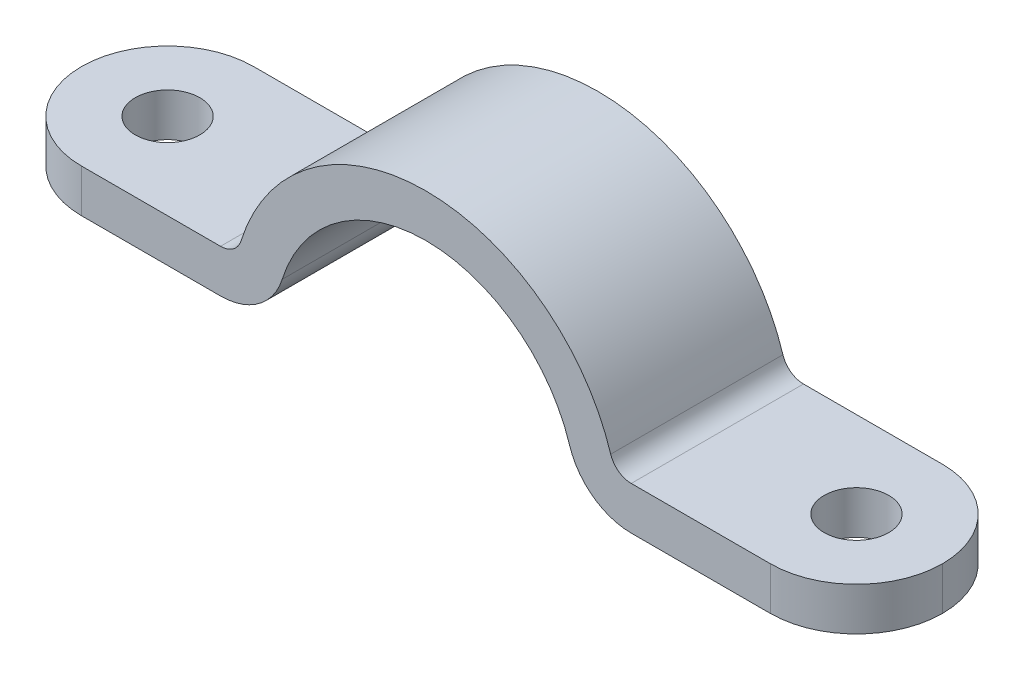
ISO-10303-21;
HEADER;
FILE_DESCRIPTION(('STEP AP214'),'2;1');
FILE_NAME('part.step','',(''),(''),'','','');
FILE_SCHEMA(('AUTOMOTIVE_DESIGN { 1 0 10303 214 1 1 1 1 }'));
ENDSEC;
DATA;
#1=APPLICATION_CONTEXT('core data for automotive mechanical design processes');
#2=APPLICATION_PROTOCOL_DEFINITION('international standard','automotive_design',2000,#1);
#3=PRODUCT_CONTEXT('',#1,'mechanical');
#4=PRODUCT('Part','Part','',(#3));
#5=PRODUCT_RELATED_PRODUCT_CATEGORY('part','',(#4));
#6=PRODUCT_DEFINITION_FORMATION('','',#4);
#7=PRODUCT_DEFINITION_CONTEXT('part definition',#1,'design');
#8=PRODUCT_DEFINITION('design','',#6,#7);
#9=PRODUCT_DEFINITION_SHAPE('','',#8);
#10=(LENGTH_UNIT() NAMED_UNIT(*) SI_UNIT(.MILLI.,.METRE.));
#11=(NAMED_UNIT(*) PLANE_ANGLE_UNIT() SI_UNIT($,.RADIAN.));
#12=(NAMED_UNIT(*) SI_UNIT($,.STERADIAN.) SOLID_ANGLE_UNIT());
#13=UNCERTAINTY_MEASURE_WITH_UNIT(LENGTH_MEASURE(1.E-05),#10,'distance_accuracy_value','');
#14=(GEOMETRIC_REPRESENTATION_CONTEXT(3) GLOBAL_UNCERTAINTY_ASSIGNED_CONTEXT((#13)) GLOBAL_UNIT_ASSIGNED_CONTEXT((#10,
#11,#12)) REPRESENTATION_CONTEXT('',''));
#15=CARTESIAN_POINT('',(0.,0.,0.));
#16=DIRECTION('',(0.,0.,1.));
#17=DIRECTION('',(1.,0.,0.));
#18=AXIS2_PLACEMENT_3D('',#15,#16,#17);
#19=CARTESIAN_POINT('',(-100.,0.,40.));
#20=DIRECTION('',(0.,1.,0.));
#21=DIRECTION('',(-1.,0.,0.));
#22=AXIS2_PLACEMENT_3D('',#19,#20,#21);
#23=PLANE('',#22);
#24=CARTESIAN_POINT('',(-80.,0.,20.));
#25=DIRECTION('',(0.,1.,0.));
#26=DIRECTION('',(0.,0.,1.));
#27=AXIS2_PLACEMENT_3D('',#24,#25,#26);
#28=CIRCLE('',#27,7.5);
#29=CARTESIAN_POINT('',(-80.,0.,27.5));
#30=VERTEX_POINT('',#29);
#31=EDGE_CURVE('E239',#30,#30,#28,.T.);
#32=ORIENTED_EDGE('',*,*,#31,.T.);
#33=EDGE_LOOP('',(#32));
#34=FACE_BOUND('',#33,.T.);
#35=CARTESIAN_POINT('',(-80.,0.,20.));
#36=DIRECTION('',(0.,1.,0.));
#37=DIRECTION('',(-1.,0.,0.));
#38=AXIS2_PLACEMENT_3D('',#35,#36,#37);
#39=CIRCLE('',#38,20.);
#40=CARTESIAN_POINT('',(-80.,0.,40.));
#41=VERTEX_POINT('',#40);
#42=CARTESIAN_POINT('',(-100.,0.,20.));
#43=VERTEX_POINT('',#42);
#44=EDGE_CURVE('E56',#41,#43,#39,.F.);
#45=ORIENTED_EDGE('',*,*,#44,.T.);
#46=CARTESIAN_POINT('',(-80.,0.,20.));
#47=DIRECTION('',(0.,1.,0.));
#48=DIRECTION('',(-1.,0.,0.));
#49=AXIS2_PLACEMENT_3D('',#46,#47,#48);
#50=CIRCLE('',#49,20.);
#51=CARTESIAN_POINT('',(-80.,0.,0.));
#52=VERTEX_POINT('',#51);
#53=EDGE_CURVE('E232',#43,#52,#50,.F.);
#54=ORIENTED_EDGE('',*,*,#53,.T.);
#55=DIRECTION('',(1.,0.,0.));
#56=VECTOR('',#55,1.);
#57=CARTESIAN_POINT('',(-100.,0.,0.));
#58=LINE('',#57,#56);
#59=CARTESIAN_POINT('',(-47.6969600708473,0.,0.));
#60=VERTEX_POINT('',#59);
#61=EDGE_CURVE('E148',#52,#60,#58,.T.);
#62=ORIENTED_EDGE('',*,*,#61,.T.);
#63=DIRECTION('',(0.,0.,-1.));
#64=VECTOR('',#63,1.);
#65=CARTESIAN_POINT('',(-47.6969600708473,0.,40.));
#66=LINE('',#65,#64);
#67=CARTESIAN_POINT('',(-47.6969600708473,0.,40.));
#68=VERTEX_POINT('',#67);
#69=EDGE_CURVE('E146',#68,#60,#66,.T.);
#70=ORIENTED_EDGE('',*,*,#69,.F.);
#71=DIRECTION('',(1.,0.,0.));
#72=VECTOR('',#71,1.);
#73=CARTESIAN_POINT('',(-100.,0.,40.));
#74=LINE('',#73,#72);
#75=EDGE_CURVE('E133',#41,#68,#74,.T.);
#76=ORIENTED_EDGE('',*,*,#75,.F.);
#77=EDGE_LOOP('',(#45,#54,#62,#70,#76));
#78=FACE_BOUND('',#77,.T.);
#79=ADVANCED_FACE('F33',(#34,#78),#23,.F.);
#80=CARTESIAN_POINT('',(-47.6969600708473,15.,40.));
#81=DIRECTION('',(0.,0.,-1.));
#82=DIRECTION('',(-1.,0.,0.));
#83=AXIS2_PLACEMENT_3D('',#80,#81,#82);
#84=CYLINDRICAL_SURFACE('',#83,15.);
#85=CARTESIAN_POINT('',(-47.6969600708473,15.,0.));
#86=DIRECTION('',(0.,0.,1.));
#87=DIRECTION('',(-1.,0.,0.));
#88=AXIS2_PLACEMENT_3D('',#85,#86,#87);
#89=CIRCLE('',#88,15.);
#90=CARTESIAN_POINT('',(-33.3878720495931,10.5,0.));
#91=VERTEX_POINT('',#90);
#92=EDGE_CURVE('E178',#60,#91,#89,.T.);
#93=ORIENTED_EDGE('',*,*,#92,.T.);
#94=DIRECTION('',(0.,0.,-1.));
#95=VECTOR('',#94,1.);
#96=CARTESIAN_POINT('',(-33.3878720495931,10.5,40.));
#97=LINE('',#96,#95);
#98=CARTESIAN_POINT('',(-33.3878720495931,10.5,40.));
#99=VERTEX_POINT('',#98);
#100=EDGE_CURVE('E152',#99,#91,#97,.T.);
#101=ORIENTED_EDGE('',*,*,#100,.F.);
#102=CARTESIAN_POINT('',(-47.6969600708473,15.,40.));
#103=DIRECTION('',(0.,0.,1.));
#104=DIRECTION('',(-1.,0.,0.));
#105=AXIS2_PLACEMENT_3D('',#102,#103,#104);
#106=CIRCLE('',#105,15.);
#107=EDGE_CURVE('E138',#68,#99,#106,.T.);
#108=ORIENTED_EDGE('',*,*,#107,.F.);
#109=ORIENTED_EDGE('',*,*,#69,.T.);
#110=EDGE_LOOP('',(#93,#101,#108,#109));
#111=FACE_BOUND('',#110,.T.);
#112=ADVANCED_FACE('F154',(#111),#84,.T.);
#113=CARTESIAN_POINT('',(0.,0.,40.));
#114=DIRECTION('',(0.,0.,-1.));
#115=DIRECTION('',(-1.,0.,0.));
#116=AXIS2_PLACEMENT_3D('',#113,#114,#115);
#117=CYLINDRICAL_SURFACE('',#116,35.);
#118=CARTESIAN_POINT('',(0.,0.,0.));
#119=DIRECTION('',(0.,0.,-1.));
#120=DIRECTION('',(1.,0.,0.));
#121=AXIS2_PLACEMENT_3D('',#118,#119,#120);
#122=CIRCLE('',#121,35.);
#123=CARTESIAN_POINT('',(33.3878720495931,10.5,0.));
#124=VERTEX_POINT('',#123);
#125=EDGE_CURVE('E181',#91,#124,#122,.T.);
#126=ORIENTED_EDGE('',*,*,#125,.T.);
#127=DIRECTION('',(0.,0.,-1.));
#128=VECTOR('',#127,1.);
#129=CARTESIAN_POINT('',(33.3878720495931,10.5,40.));
#130=LINE('',#129,#128);
#131=CARTESIAN_POINT('',(33.3878720495931,10.5,40.));
#132=VERTEX_POINT('',#131);
#133=EDGE_CURVE('E211',#132,#124,#130,.T.);
#134=ORIENTED_EDGE('',*,*,#133,.F.);
#135=CARTESIAN_POINT('',(0.,0.,40.));
#136=DIRECTION('',(0.,0.,-1.));
#137=DIRECTION('',(1.,0.,0.));
#138=AXIS2_PLACEMENT_3D('',#135,#136,#137);
#139=CIRCLE('',#138,35.);
#140=EDGE_CURVE('E157',#99,#132,#139,.T.);
#141=ORIENTED_EDGE('',*,*,#140,.F.);
#142=ORIENTED_EDGE('',*,*,#100,.T.);
#143=EDGE_LOOP('',(#126,#134,#141,#142));
#144=FACE_BOUND('',#143,.T.);
#145=ADVANCED_FACE('F288',(#144),#117,.F.);
#146=CARTESIAN_POINT('',(47.6969600708473,15.,40.));
#147=DIRECTION('',(0.,0.,-1.));
#148=DIRECTION('',(-1.,0.,0.));
#149=AXIS2_PLACEMENT_3D('',#146,#147,#148);
#150=CYLINDRICAL_SURFACE('',#149,15.);
#151=CARTESIAN_POINT('',(47.6969600708473,15.,0.));
#152=DIRECTION('',(0.,0.,1.));
#153=DIRECTION('',(-1.,0.,0.));
#154=AXIS2_PLACEMENT_3D('',#151,#152,#153);
#155=CIRCLE('',#154,15.);
#156=CARTESIAN_POINT('',(47.6969600708473,0.,0.));
#157=VERTEX_POINT('',#156);
#158=EDGE_CURVE('E183',#124,#157,#155,.T.);
#159=ORIENTED_EDGE('',*,*,#158,.T.);
#160=DIRECTION('',(0.,0.,-1.));
#161=VECTOR('',#160,1.);
#162=CARTESIAN_POINT('',(47.6969600708473,0.,40.));
#163=LINE('',#162,#161);
#164=CARTESIAN_POINT('',(47.6969600708473,0.,40.));
#165=VERTEX_POINT('',#164);
#166=EDGE_CURVE('E208',#165,#157,#163,.T.);
#167=ORIENTED_EDGE('',*,*,#166,.F.);
#168=CARTESIAN_POINT('',(47.6969600708473,15.,40.));
#169=DIRECTION('',(0.,0.,1.));
#170=DIRECTION('',(-1.,0.,0.));
#171=AXIS2_PLACEMENT_3D('',#168,#169,#170);
#172=CIRCLE('',#171,15.);
#173=EDGE_CURVE('E159',#132,#165,#172,.T.);
#174=ORIENTED_EDGE('',*,*,#173,.F.);
#175=ORIENTED_EDGE('',*,*,#133,.T.);
#176=EDGE_LOOP('',(#159,#167,#174,#175));
#177=FACE_BOUND('',#176,.T.);
#178=ADVANCED_FACE('F284',(#177),#150,.T.);
#179=CARTESIAN_POINT('',(47.6969600708473,0.,40.));
#180=DIRECTION('',(0.,1.,0.));
#181=DIRECTION('',(-1.,0.,0.));
#182=AXIS2_PLACEMENT_3D('',#179,#180,#181);
#183=PLANE('',#182);
#184=CARTESIAN_POINT('',(80.,0.,20.));
#185=DIRECTION('',(0.,1.,0.));
#186=DIRECTION('',(0.,0.,1.));
#187=AXIS2_PLACEMENT_3D('',#184,#185,#186);
#188=CIRCLE('',#187,7.5);
#189=CARTESIAN_POINT('',(80.,0.,27.5));
#190=VERTEX_POINT('',#189);
#191=EDGE_CURVE('E248',#190,#190,#188,.T.);
#192=ORIENTED_EDGE('',*,*,#191,.T.);
#193=EDGE_LOOP('',(#192));
#194=FACE_BOUND('',#193,.T.);
#195=DIRECTION('',(1.,0.,0.));
#196=VECTOR('',#195,1.);
#197=CARTESIAN_POINT('',(47.6969600708473,0.,0.));
#198=LINE('',#197,#196);
#199=CARTESIAN_POINT('',(80.,0.,0.));
#200=VERTEX_POINT('',#199);
#201=EDGE_CURVE('E185',#157,#200,#198,.T.);
#202=ORIENTED_EDGE('',*,*,#201,.T.);
#203=CARTESIAN_POINT('',(80.,0.,20.));
#204=DIRECTION('',(0.,1.,0.));
#205=DIRECTION('',(-1.,0.,0.));
#206=AXIS2_PLACEMENT_3D('',#203,#204,#205);
#207=CIRCLE('',#206,20.);
#208=CARTESIAN_POINT('',(100.,0.,20.));
#209=VERTEX_POINT('',#208);
#210=EDGE_CURVE('E226',#200,#209,#207,.F.);
#211=ORIENTED_EDGE('',*,*,#210,.T.);
#212=CARTESIAN_POINT('',(80.,0.,20.));
#213=DIRECTION('',(0.,1.,0.));
#214=DIRECTION('',(-1.,0.,0.));
#215=AXIS2_PLACEMENT_3D('',#212,#213,#214);
#216=CIRCLE('',#215,20.);
#217=CARTESIAN_POINT('',(80.,0.,40.));
#218=VERTEX_POINT('',#217);
#219=EDGE_CURVE('E224',#209,#218,#216,.F.);
#220=ORIENTED_EDGE('',*,*,#219,.T.);
#221=DIRECTION('',(1.,0.,0.));
#222=VECTOR('',#221,1.);
#223=CARTESIAN_POINT('',(47.6969600708473,0.,40.));
#224=LINE('',#223,#222);
#225=EDGE_CURVE('E164',#165,#218,#224,.T.);
#226=ORIENTED_EDGE('',*,*,#225,.F.);
#227=ORIENTED_EDGE('',*,*,#166,.T.);
#228=EDGE_LOOP('',(#202,#211,#220,#226,#227));
#229=FACE_BOUND('',#228,.T.);
#230=ADVANCED_FACE('F262',(#194,#229),#183,.F.);
#231=CARTESIAN_POINT('',(47.6969600708473,10.,40.));
#232=DIRECTION('',(0.,-1.,0.));
#233=DIRECTION('',(1.,0.,0.));
#234=AXIS2_PLACEMENT_3D('',#231,#232,#233);
#235=PLANE('',#234);
#236=CARTESIAN_POINT('',(80.,10.,20.));
#237=DIRECTION('',(0.,1.,0.));
#238=DIRECTION('',(0.,0.,1.));
#239=AXIS2_PLACEMENT_3D('',#236,#237,#238);
#240=CIRCLE('',#239,7.5);
#241=CARTESIAN_POINT('',(80.,10.,27.5));
#242=VERTEX_POINT('',#241);
#243=EDGE_CURVE('E252',#242,#242,#240,.T.);
#244=ORIENTED_EDGE('',*,*,#243,.F.);
#245=EDGE_LOOP('',(#244));
#246=FACE_BOUND('',#245,.T.);
#247=CARTESIAN_POINT('',(80.,10.,20.));
#248=DIRECTION('',(0.,-1.,0.));
#249=DIRECTION('',(1.,0.,0.));
#250=AXIS2_PLACEMENT_3D('',#247,#248,#249);
#251=CIRCLE('',#250,20.);
#252=CARTESIAN_POINT('',(80.,10.,40.));
#253=VERTEX_POINT('',#252);
#254=CARTESIAN_POINT('',(100.,10.,20.));
#255=VERTEX_POINT('',#254);
#256=EDGE_CURVE('E151',#253,#255,#251,.F.);
#257=ORIENTED_EDGE('',*,*,#256,.T.);
#258=CARTESIAN_POINT('',(80.,10.,20.));
#259=DIRECTION('',(0.,-1.,0.));
#260=DIRECTION('',(1.,0.,0.));
#261=AXIS2_PLACEMENT_3D('',#258,#259,#260);
#262=CIRCLE('',#261,20.);
#263=CARTESIAN_POINT('',(80.,10.,0.));
#264=VERTEX_POINT('',#263);
#265=EDGE_CURVE('E216',#255,#264,#262,.F.);
#266=ORIENTED_EDGE('',*,*,#265,.T.);
#267=DIRECTION('',(-1.,0.,0.));
#268=VECTOR('',#267,1.);
#269=CARTESIAN_POINT('',(47.6969600708473,10.,0.));
#270=LINE('',#269,#268);
#271=CARTESIAN_POINT('',(47.6969600708473,10.,0.));
#272=VERTEX_POINT('',#271);
#273=EDGE_CURVE('E188',#264,#272,#270,.T.);
#274=ORIENTED_EDGE('',*,*,#273,.T.);
#275=DIRECTION('',(0.,0.,-1.));
#276=VECTOR('',#275,1.);
#277=CARTESIAN_POINT('',(47.6969600708473,10.,40.));
#278=LINE('',#277,#276);
#279=CARTESIAN_POINT('',(47.6969600708473,10.,40.));
#280=VERTEX_POINT('',#279);
#281=EDGE_CURVE('E205',#280,#272,#278,.T.);
#282=ORIENTED_EDGE('',*,*,#281,.F.);
#283=DIRECTION('',(-1.,0.,0.));
#284=VECTOR('',#283,1.);
#285=CARTESIAN_POINT('',(47.6969600708473,10.,40.));
#286=LINE('',#285,#284);
#287=EDGE_CURVE('E166',#253,#280,#286,.T.);
#288=ORIENTED_EDGE('',*,*,#287,.F.);
#289=EDGE_LOOP('',(#257,#266,#274,#282,#288));
#290=FACE_BOUND('',#289,.T.);
#291=ADVANCED_FACE('F258',(#246,#290),#235,.F.);
#292=CARTESIAN_POINT('',(47.6969600708473,15.,40.));
#293=DIRECTION('',(0.,0.,-1.));
#294=DIRECTION('',(-1.,0.,0.));
#295=AXIS2_PLACEMENT_3D('',#292,#293,#294);
#296=CYLINDRICAL_SURFACE('',#295,5.);
#297=CARTESIAN_POINT('',(47.6969600708473,15.,0.));
#298=DIRECTION('',(0.,0.,-1.));
#299=DIRECTION('',(-1.,0.,0.));
#300=AXIS2_PLACEMENT_3D('',#297,#298,#299);
#301=CIRCLE('',#300,5.);
#302=CARTESIAN_POINT('',(42.9272640637626,13.5,0.));
#303=VERTEX_POINT('',#302);
#304=EDGE_CURVE('E190',#272,#303,#301,.T.);
#305=ORIENTED_EDGE('',*,*,#304,.T.);
#306=DIRECTION('',(0.,0.,-1.));
#307=VECTOR('',#306,1.);
#308=CARTESIAN_POINT('',(42.9272640637626,13.5,40.));
#309=LINE('',#308,#307);
#310=CARTESIAN_POINT('',(42.9272640637626,13.5,40.));
#311=VERTEX_POINT('',#310);
#312=EDGE_CURVE('E202',#311,#303,#309,.T.);
#313=ORIENTED_EDGE('',*,*,#312,.F.);
#314=CARTESIAN_POINT('',(47.6969600708473,15.,40.));
#315=DIRECTION('',(0.,0.,-1.));
#316=DIRECTION('',(-1.,0.,0.));
#317=AXIS2_PLACEMENT_3D('',#314,#315,#316);
#318=CIRCLE('',#317,5.);
#319=EDGE_CURVE('E168',#280,#311,#318,.T.);
#320=ORIENTED_EDGE('',*,*,#319,.F.);
#321=ORIENTED_EDGE('',*,*,#281,.T.);
#322=EDGE_LOOP('',(#305,#313,#320,#321));
#323=FACE_BOUND('',#322,.T.);
#324=ADVANCED_FACE('F261',(#323),#296,.F.);
#325=CARTESIAN_POINT('',(0.,0.,40.));
#326=DIRECTION('',(0.,0.,-1.));
#327=DIRECTION('',(-1.,0.,0.));
#328=AXIS2_PLACEMENT_3D('',#325,#326,#327);
#329=CYLINDRICAL_SURFACE('',#328,45.);
#330=CARTESIAN_POINT('',(0.,0.,0.));
#331=DIRECTION('',(0.,0.,1.));
#332=DIRECTION('',(1.,0.,0.));
#333=AXIS2_PLACEMENT_3D('',#330,#331,#332);
#334=CIRCLE('',#333,45.);
#335=CARTESIAN_POINT('',(-42.9272640637626,13.5,0.));
#336=VERTEX_POINT('',#335);
#337=EDGE_CURVE('E192',#303,#336,#334,.T.);
#338=ORIENTED_EDGE('',*,*,#337,.T.);
#339=DIRECTION('',(0.,0.,-1.));
#340=VECTOR('',#339,1.);
#341=CARTESIAN_POINT('',(-42.9272640637626,13.5,40.));
#342=LINE('',#341,#340);
#343=CARTESIAN_POINT('',(-42.9272640637626,13.5,40.));
#344=VERTEX_POINT('',#343);
#345=EDGE_CURVE('E199',#344,#336,#342,.T.);
#346=ORIENTED_EDGE('',*,*,#345,.F.);
#347=CARTESIAN_POINT('',(0.,0.,40.));
#348=DIRECTION('',(0.,0.,1.));
#349=DIRECTION('',(1.,0.,0.));
#350=AXIS2_PLACEMENT_3D('',#347,#348,#349);
#351=CIRCLE('',#350,45.);
#352=EDGE_CURVE('E170',#311,#344,#351,.T.);
#353=ORIENTED_EDGE('',*,*,#352,.F.);
#354=ORIENTED_EDGE('',*,*,#312,.T.);
#355=EDGE_LOOP('',(#338,#346,#353,#354));
#356=FACE_BOUND('',#355,.T.);
#357=ADVANCED_FACE('F296',(#356),#329,.T.);
#358=CARTESIAN_POINT('',(-47.6969600708473,15.,40.));
#359=DIRECTION('',(0.,0.,-1.));
#360=DIRECTION('',(-1.,0.,0.));
#361=AXIS2_PLACEMENT_3D('',#358,#359,#360);
#362=CYLINDRICAL_SURFACE('',#361,5.);
#363=CARTESIAN_POINT('',(-47.6969600708473,15.,0.));
#364=DIRECTION('',(0.,0.,-1.));
#365=DIRECTION('',(-1.,0.,0.));
#366=AXIS2_PLACEMENT_3D('',#363,#364,#365);
#367=CIRCLE('',#366,5.);
#368=CARTESIAN_POINT('',(-47.6969600708473,10.,0.));
#369=VERTEX_POINT('',#368);
#370=EDGE_CURVE('E194',#336,#369,#367,.T.);
#371=ORIENTED_EDGE('',*,*,#370,.T.);
#372=DIRECTION('',(0.,0.,-1.));
#373=VECTOR('',#372,1.);
#374=CARTESIAN_POINT('',(-47.6969600708473,10.,40.));
#375=LINE('',#374,#373);
#376=CARTESIAN_POINT('',(-47.6969600708473,10.,40.));
#377=VERTEX_POINT('',#376);
#378=EDGE_CURVE('E176',#377,#369,#375,.T.);
#379=ORIENTED_EDGE('',*,*,#378,.F.);
#380=CARTESIAN_POINT('',(-47.6969600708473,15.,40.));
#381=DIRECTION('',(0.,0.,-1.));
#382=DIRECTION('',(-1.,0.,0.));
#383=AXIS2_PLACEMENT_3D('',#380,#381,#382);
#384=CIRCLE('',#383,5.);
#385=EDGE_CURVE('E172',#344,#377,#384,.T.);
#386=ORIENTED_EDGE('',*,*,#385,.F.);
#387=ORIENTED_EDGE('',*,*,#345,.T.);
#388=EDGE_LOOP('',(#371,#379,#386,#387));
#389=FACE_BOUND('',#388,.T.);
#390=ADVANCED_FACE('F301',(#389),#362,.F.);
#391=CARTESIAN_POINT('',(-100.,10.,40.));
#392=DIRECTION('',(0.,-1.,0.));
#393=DIRECTION('',(0.,0.,-1.));
#394=AXIS2_PLACEMENT_3D('',#391,#392,#393);
#395=PLANE('',#394);
#396=CARTESIAN_POINT('',(-80.,10.,20.));
#397=DIRECTION('',(0.,1.,0.));
#398=DIRECTION('',(0.,0.,1.));
#399=AXIS2_PLACEMENT_3D('',#396,#397,#398);
#400=CIRCLE('',#399,7.5);
#401=CARTESIAN_POINT('',(-80.,10.,27.5));
#402=VERTEX_POINT('',#401);
#403=EDGE_CURVE('E243',#402,#402,#400,.T.);
#404=ORIENTED_EDGE('',*,*,#403,.F.);
#405=EDGE_LOOP('',(#404));
#406=FACE_BOUND('',#405,.T.);
#407=DIRECTION('',(-1.,0.,0.));
#408=VECTOR('',#407,1.);
#409=CARTESIAN_POINT('',(-100.,10.,0.));
#410=LINE('',#409,#408);
#411=CARTESIAN_POINT('',(-80.,10.,0.));
#412=VERTEX_POINT('',#411);
#413=EDGE_CURVE('E143',#369,#412,#410,.T.);
#414=ORIENTED_EDGE('',*,*,#413,.T.);
#415=CARTESIAN_POINT('',(-80.,10.,20.));
#416=DIRECTION('',(0.,-1.,0.));
#417=DIRECTION('',(0.,0.,-1.));
#418=AXIS2_PLACEMENT_3D('',#415,#416,#417);
#419=CIRCLE('',#418,20.);
#420=CARTESIAN_POINT('',(-100.,10.,20.));
#421=VERTEX_POINT('',#420);
#422=EDGE_CURVE('E11',#412,#421,#419,.F.);
#423=ORIENTED_EDGE('',*,*,#422,.T.);
#424=CARTESIAN_POINT('',(-80.,10.,20.));
#425=DIRECTION('',(0.,-1.,0.));
#426=DIRECTION('',(0.,0.,-1.));
#427=AXIS2_PLACEMENT_3D('',#424,#425,#426);
#428=CIRCLE('',#427,20.);
#429=CARTESIAN_POINT('',(-80.,10.,40.));
#430=VERTEX_POINT('',#429);
#431=EDGE_CURVE('E42',#421,#430,#428,.F.);
#432=ORIENTED_EDGE('',*,*,#431,.T.);
#433=DIRECTION('',(-1.,0.,0.));
#434=VECTOR('',#433,1.);
#435=CARTESIAN_POINT('',(-100.,10.,40.));
#436=LINE('',#435,#434);
#437=EDGE_CURVE('E174',#377,#430,#436,.T.);
#438=ORIENTED_EDGE('',*,*,#437,.F.);
#439=ORIENTED_EDGE('',*,*,#378,.T.);
#440=EDGE_LOOP('',(#414,#423,#432,#438,#439));
#441=FACE_BOUND('',#440,.T.);
#442=ADVANCED_FACE('F304',(#406,#441),#395,.F.);
#443=CARTESIAN_POINT('',(-47.6969600708473,15.,40.));
#444=DIRECTION('',(0.,0.,-1.));
#445=DIRECTION('',(-1.,0.,0.));
#446=AXIS2_PLACEMENT_3D('',#443,#444,#445);
#447=PLANE('',#446);
#448=ORIENTED_EDGE('',*,*,#225,.T.);
#449=DIRECTION('',(0.,1.,0.));
#450=VECTOR('',#449,1.);
#451=CARTESIAN_POINT('',(80.,15.,40.));
#452=LINE('',#451,#450);
#453=EDGE_CURVE('E229',#218,#253,#452,.T.);
#454=ORIENTED_EDGE('',*,*,#453,.T.);
#455=ORIENTED_EDGE('',*,*,#287,.T.);
#456=ORIENTED_EDGE('',*,*,#319,.T.);
#457=ORIENTED_EDGE('',*,*,#352,.T.);
#458=ORIENTED_EDGE('',*,*,#385,.T.);
#459=ORIENTED_EDGE('',*,*,#437,.T.);
#460=DIRECTION('',(0.,-1.,0.));
#461=VECTOR('',#460,1.);
#462=CARTESIAN_POINT('',(-80.,15.,40.));
#463=LINE('',#462,#461);
#464=EDGE_CURVE('E142',#430,#41,#463,.T.);
#465=ORIENTED_EDGE('',*,*,#464,.T.);
#466=ORIENTED_EDGE('',*,*,#75,.T.);
#467=ORIENTED_EDGE('',*,*,#107,.T.);
#468=ORIENTED_EDGE('',*,*,#140,.T.);
#469=ORIENTED_EDGE('',*,*,#173,.T.);
#470=EDGE_LOOP('',(#448,#454,#455,#456,#457,#458,#459,#465,#466,#467,#468,#469));
#471=FACE_BOUND('',#470,.T.);
#472=ADVANCED_FACE('F136',(#471),#447,.F.);
#473=CARTESIAN_POINT('',(-47.6969600708473,15.,0.));
#474=DIRECTION('',(0.,0.,-1.));
#475=DIRECTION('',(-1.,0.,0.));
#476=AXIS2_PLACEMENT_3D('',#473,#474,#475);
#477=PLANE('',#476);
#478=ORIENTED_EDGE('',*,*,#273,.F.);
#479=DIRECTION('',(0.,1.,0.));
#480=VECTOR('',#479,1.);
#481=CARTESIAN_POINT('',(80.,0.,0.));
#482=LINE('',#481,#480);
#483=EDGE_CURVE('E221',#264,#200,#482,.F.);
#484=ORIENTED_EDGE('',*,*,#483,.T.);
#485=ORIENTED_EDGE('',*,*,#201,.F.);
#486=ORIENTED_EDGE('',*,*,#158,.F.);
#487=ORIENTED_EDGE('',*,*,#125,.F.);
#488=ORIENTED_EDGE('',*,*,#92,.F.);
#489=ORIENTED_EDGE('',*,*,#61,.F.);
#490=DIRECTION('',(0.,-1.,0.));
#491=VECTOR('',#490,1.);
#492=CARTESIAN_POINT('',(-80.,10.,0.));
#493=LINE('',#492,#491);
#494=EDGE_CURVE('E218',#52,#412,#493,.F.);
#495=ORIENTED_EDGE('',*,*,#494,.T.);
#496=ORIENTED_EDGE('',*,*,#413,.F.);
#497=ORIENTED_EDGE('',*,*,#370,.F.);
#498=ORIENTED_EDGE('',*,*,#337,.F.);
#499=ORIENTED_EDGE('',*,*,#304,.F.);
#500=EDGE_LOOP('',(#478,#484,#485,#486,#487,#488,#489,#495,#496,#497,#498,#499));
#501=FACE_BOUND('',#500,.T.);
#502=ADVANCED_FACE('F276',(#501),#477,.T.);
#503=CARTESIAN_POINT('',(80.,15.,20.));
#504=DIRECTION('',(0.,1.,0.));
#505=DIRECTION('',(0.,0.,1.));
#506=AXIS2_PLACEMENT_3D('',#503,#504,#505);
#507=CYLINDRICAL_SURFACE('',#506,20.);
#508=ORIENTED_EDGE('',*,*,#453,.F.);
#509=ORIENTED_EDGE('',*,*,#219,.F.);
#510=DIRECTION('',(0.,1.,0.));
#511=VECTOR('',#510,1.);
#512=CARTESIAN_POINT('',(100.,10.,20.));
#513=LINE('',#512,#511);
#514=EDGE_CURVE('E179',#255,#209,#513,.F.);
#515=ORIENTED_EDGE('',*,*,#514,.F.);
#516=ORIENTED_EDGE('',*,*,#256,.F.);
#517=EDGE_LOOP('',(#508,#509,#515,#516));
#518=FACE_BOUND('',#517,.T.);
#519=ADVANCED_FACE('F271',(#518),#507,.T.);
#520=CARTESIAN_POINT('',(80.,10.,20.));
#521=DIRECTION('',(0.,-1.,0.));
#522=DIRECTION('',(0.,0.,-1.));
#523=AXIS2_PLACEMENT_3D('',#520,#521,#522);
#524=CYLINDRICAL_SURFACE('',#523,20.);
#525=ORIENTED_EDGE('',*,*,#210,.F.);
#526=ORIENTED_EDGE('',*,*,#483,.F.);
#527=ORIENTED_EDGE('',*,*,#265,.F.);
#528=ORIENTED_EDGE('',*,*,#514,.T.);
#529=EDGE_LOOP('',(#525,#526,#527,#528));
#530=FACE_BOUND('',#529,.T.);
#531=ADVANCED_FACE('F273',(#530),#524,.T.);
#532=CARTESIAN_POINT('',(-80.,15.,20.));
#533=DIRECTION('',(0.,-1.,0.));
#534=DIRECTION('',(0.,0.,-1.));
#535=AXIS2_PLACEMENT_3D('',#532,#533,#534);
#536=CYLINDRICAL_SURFACE('',#535,20.);
#537=ORIENTED_EDGE('',*,*,#464,.F.);
#538=ORIENTED_EDGE('',*,*,#431,.F.);
#539=DIRECTION('',(0.,-1.,0.));
#540=VECTOR('',#539,1.);
#541=CARTESIAN_POINT('',(-100.,10.,20.));
#542=LINE('',#541,#540);
#543=EDGE_CURVE('E37',#43,#421,#542,.F.);
#544=ORIENTED_EDGE('',*,*,#543,.F.);
#545=ORIENTED_EDGE('',*,*,#44,.F.);
#546=EDGE_LOOP('',(#537,#538,#544,#545));
#547=FACE_BOUND('',#546,.T.);
#548=ADVANCED_FACE('F35',(#547),#536,.T.);
#549=CARTESIAN_POINT('',(-80.,10.,20.));
#550=DIRECTION('',(0.,1.,0.));
#551=DIRECTION('',(0.,0.,1.));
#552=AXIS2_PLACEMENT_3D('',#549,#550,#551);
#553=CYLINDRICAL_SURFACE('',#552,20.);
#554=ORIENTED_EDGE('',*,*,#422,.F.);
#555=ORIENTED_EDGE('',*,*,#494,.F.);
#556=ORIENTED_EDGE('',*,*,#53,.F.);
#557=ORIENTED_EDGE('',*,*,#543,.T.);
#558=EDGE_LOOP('',(#554,#555,#556,#557));
#559=FACE_BOUND('',#558,.T.);
#560=ADVANCED_FACE('F307',(#559),#553,.T.);
#561=CARTESIAN_POINT('',(-80.,0.,20.));
#562=DIRECTION('',(0.,1.,0.));
#563=DIRECTION('',(0.,0.,1.));
#564=AXIS2_PLACEMENT_3D('',#561,#562,#563);
#565=CYLINDRICAL_SURFACE('',#564,7.5);
#566=ORIENTED_EDGE('',*,*,#31,.F.);
#567=EDGE_LOOP('',(#566));
#568=FACE_BOUND('',#567,.T.);
#569=ORIENTED_EDGE('',*,*,#403,.T.);
#570=EDGE_LOOP('',(#569));
#571=FACE_BOUND('',#570,.T.);
#572=ADVANCED_FACE('F309',(#568,#571),#565,.F.);
#573=CARTESIAN_POINT('',(80.,0.,20.));
#574=DIRECTION('',(0.,1.,0.));
#575=DIRECTION('',(0.,0.,1.));
#576=AXIS2_PLACEMENT_3D('',#573,#574,#575);
#577=CYLINDRICAL_SURFACE('',#576,7.5);
#578=ORIENTED_EDGE('',*,*,#191,.F.);
#579=EDGE_LOOP('',(#578));
#580=FACE_BOUND('',#579,.T.);
#581=ORIENTED_EDGE('',*,*,#243,.T.);
#582=EDGE_LOOP('',(#581));
#583=FACE_BOUND('',#582,.T.);
#584=ADVANCED_FACE('F256',(#580,#583),#577,.F.);
#585=CLOSED_SHELL('',(#79,#112,#145,#178,#230,#291,#324,#357,#390,#442,#472,#502,#519,#531,#548,
#560,#572,#584));
#586=MANIFOLD_SOLID_BREP('B2',#585);
#587=ADVANCED_BREP_SHAPE_REPRESENTATION('',(#18,#586),#14);
#588=SHAPE_DEFINITION_REPRESENTATION(#9,#587);
ENDSEC;
END-ISO-10303-21;
